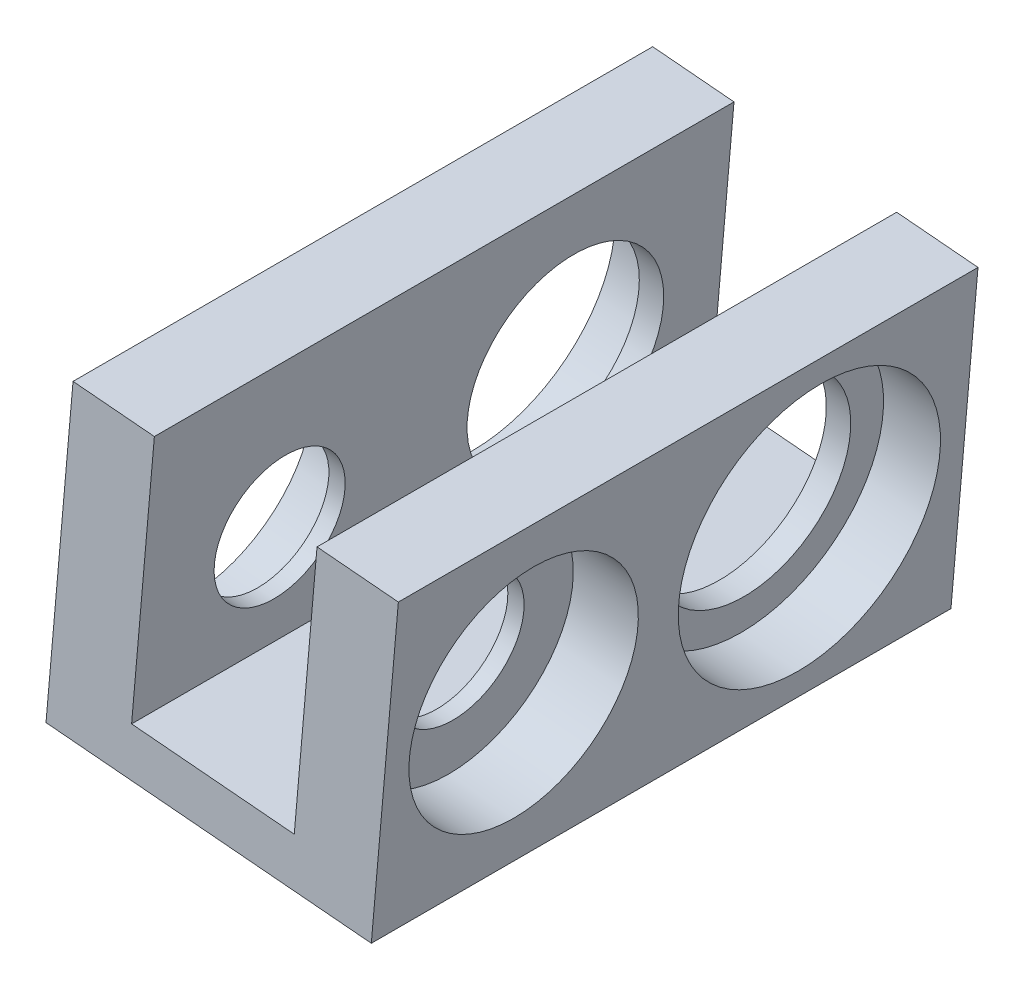
ISO-10303-21;
HEADER;
FILE_DESCRIPTION(('STEP AP214'),'2;1');
FILE_NAME('part.step','',(''),(''),'','','');
FILE_SCHEMA(('AUTOMOTIVE_DESIGN { 1 0 10303 214 1 1 1 1 }'));
ENDSEC;
DATA;
#1=APPLICATION_CONTEXT('core data for automotive mechanical design processes');
#2=APPLICATION_PROTOCOL_DEFINITION('international standard','automotive_design',2000,#1);
#3=PRODUCT_CONTEXT('',#1,'mechanical');
#4=PRODUCT('Part','Part','',(#3));
#5=PRODUCT_RELATED_PRODUCT_CATEGORY('part','',(#4));
#6=PRODUCT_DEFINITION_FORMATION('','',#4);
#7=PRODUCT_DEFINITION_CONTEXT('part definition',#1,'design');
#8=PRODUCT_DEFINITION('design','',#6,#7);
#9=PRODUCT_DEFINITION_SHAPE('','',#8);
#10=(LENGTH_UNIT() NAMED_UNIT(*) SI_UNIT(.MILLI.,.METRE.));
#11=(NAMED_UNIT(*) PLANE_ANGLE_UNIT() SI_UNIT($,.RADIAN.));
#12=(NAMED_UNIT(*) SI_UNIT($,.STERADIAN.) SOLID_ANGLE_UNIT());
#13=UNCERTAINTY_MEASURE_WITH_UNIT(LENGTH_MEASURE(1.E-05),#10,'distance_accuracy_value','');
#14=(GEOMETRIC_REPRESENTATION_CONTEXT(3) GLOBAL_UNCERTAINTY_ASSIGNED_CONTEXT((#13)) GLOBAL_UNIT_ASSIGNED_CONTEXT((#10,
#11,#12)) REPRESENTATION_CONTEXT('',''));
#15=CARTESIAN_POINT('',(0.,0.,0.));
#16=DIRECTION('',(0.,0.,1.));
#17=DIRECTION('',(1.,0.,0.));
#18=AXIS2_PLACEMENT_3D('',#15,#16,#17);
#19=CARTESIAN_POINT('',(41.5037470358753,15.441469553837,17.5000000000001));
#20=DIRECTION('',(-0.996194698091746,0.087155742747655,0.));
#21=DIRECTION('',(-0.087155742747655,-0.996194698091746,0.));
#22=AXIS2_PLACEMENT_3D('',#19,#20,#21);
#23=CYLINDRICAL_SURFACE('',#22,8.);
#24=CARTESIAN_POINT('',(11.6179060931229,18.0561418362666,17.5000000000001));
#25=DIRECTION('',(-0.996194698091746,0.0871557427476548,0.));
#26=DIRECTION('',(-0.0871557427476548,-0.996194698091746,0.));
#27=AXIS2_PLACEMENT_3D('',#24,#25,#26);
#28=CIRCLE('',#27,8.);
#29=CARTESIAN_POINT('',(10.9206601511417,10.0865842515327,17.5000000000001));
#30=VERTEX_POINT('',#29);
#31=EDGE_CURVE('E147',#30,#30,#28,.F.);
#32=ORIENTED_EDGE('',*,*,#31,.T.);
#33=EDGE_LOOP('',(#32));
#34=FACE_BOUND('',#33,.T.);
#35=CARTESIAN_POINT('',(9.62551669693942,18.2304533217619,17.5000000000001));
#36=DIRECTION('',(-0.996194698091746,0.087155742747655,0.));
#37=DIRECTION('',(-0.087155742747655,-0.996194698091746,0.));
#38=AXIS2_PLACEMENT_3D('',#35,#36,#37);
#39=CIRCLE('',#38,8.);
#40=CARTESIAN_POINT('',(8.92827075495818,10.260895737028,17.5000000000001));
#41=VERTEX_POINT('',#40);
#42=EDGE_CURVE('E166',#41,#41,#39,.F.);
#43=ORIENTED_EDGE('',*,*,#42,.F.);
#44=EDGE_LOOP('',(#43));
#45=FACE_BOUND('',#44,.T.);
#46=ADVANCED_FACE('F33',(#34,#45),#23,.F.);
#47=CARTESIAN_POINT('',(41.5037470358753,15.441469553837,-17.4999999999999));
#48=DIRECTION('',(-0.996194698091746,0.087155742747655,0.));
#49=DIRECTION('',(-0.087155742747655,-0.996194698091746,0.));
#50=AXIS2_PLACEMENT_3D('',#47,#48,#49);
#51=CYLINDRICAL_SURFACE('',#50,12.);
#52=CARTESIAN_POINT('',(11.6179060931229,18.0561418362666,-17.4999999999999));
#53=DIRECTION('',(-0.996194698091746,0.0871557427476548,0.));
#54=DIRECTION('',(-0.0871557427476548,-0.996194698091746,0.));
#55=AXIS2_PLACEMENT_3D('',#52,#53,#54);
#56=CIRCLE('',#55,12.);
#57=CARTESIAN_POINT('',(10.572037180151,6.10180545916567,-17.4999999999999));
#58=VERTEX_POINT('',#57);
#59=EDGE_CURVE('E144',#58,#58,#56,.F.);
#60=ORIENTED_EDGE('',*,*,#59,.T.);
#61=EDGE_LOOP('',(#60));
#62=FACE_BOUND('',#61,.T.);
#63=CARTESIAN_POINT('',(8.62932199884767,18.3176090645096,-17.4999999999999));
#64=DIRECTION('',(-0.996194698091746,0.087155742747655,0.));
#65=DIRECTION('',(-0.087155742747655,-0.996194698091746,0.));
#66=AXIS2_PLACEMENT_3D('',#63,#64,#65);
#67=CIRCLE('',#66,12.);
#68=CARTESIAN_POINT('',(7.58345308587581,6.36327268740863,-17.4999999999999));
#69=VERTEX_POINT('',#68);
#70=EDGE_CURVE('E173',#69,#69,#67,.F.);
#71=ORIENTED_EDGE('',*,*,#70,.F.);
#72=EDGE_LOOP('',(#71));
#73=FACE_BOUND('',#72,.T.);
#74=ADVANCED_FACE('F219',(#62,#73),#51,.F.);
#75=CARTESIAN_POINT('',(43.1597061480807,34.3691688175801,-36.4999999999999));
#76=DIRECTION('',(0.087155742747655,0.996194698091746,0.));
#77=DIRECTION('',(-0.996194698091746,0.087155742747655,0.));
#78=AXIS2_PLACEMENT_3D('',#75,#76,#77);
#79=PLANE('',#78);
#80=DIRECTION('',(0.,0.,1.));
#81=VECTOR('',#80,1.);
#82=CARTESIAN_POINT('',(13.2738652053283,36.9838411000098,-36.5));
#83=LINE('',#82,#81);
#84=CARTESIAN_POINT('',(13.2738652053283,36.9838411000098,-36.5));
#85=VERTEX_POINT('',#84);
#86=CARTESIAN_POINT('',(13.2738652053283,36.9838411000098,34.5));
#87=VERTEX_POINT('',#86);
#88=EDGE_CURVE('E132',#85,#87,#83,.T.);
#89=ORIENTED_EDGE('',*,*,#88,.F.);
#90=DIRECTION('',(-0.996194698091746,0.087155742747655,0.));
#91=VECTOR('',#90,1.);
#92=CARTESIAN_POINT('',(43.1597061480807,34.3691688175801,-36.4999999999999));
#93=LINE('',#92,#91);
#94=CARTESIAN_POINT('',(3.31191822441089,37.8553985274863,-36.4999999999999));
#95=VERTEX_POINT('',#94);
#96=EDGE_CURVE('E42',#85,#95,#93,.T.);
#97=ORIENTED_EDGE('',*,*,#96,.T.);
#98=DIRECTION('',(0.,0.,-1.));
#99=VECTOR('',#98,1.);
#100=CARTESIAN_POINT('',(3.31191822441089,37.8553985274863,-36.4999999999999));
#101=LINE('',#100,#99);
#102=CARTESIAN_POINT('',(3.31191822441089,37.8553985274863,34.5000000000002));
#103=VERTEX_POINT('',#102);
#104=EDGE_CURVE('E180',#103,#95,#101,.T.);
#105=ORIENTED_EDGE('',*,*,#104,.F.);
#106=DIRECTION('',(-0.996194698091746,0.087155742747655,0.));
#107=VECTOR('',#106,1.);
#108=CARTESIAN_POINT('',(43.1597061480807,34.3691688175801,34.5000000000002));
#109=LINE('',#108,#107);
#110=EDGE_CURVE('E202',#87,#103,#109,.T.);
#111=ORIENTED_EDGE('',*,*,#110,.F.);
#112=EDGE_LOOP('',(#89,#97,#105,#111));
#113=FACE_BOUND('',#112,.T.);
#114=ADVANCED_FACE('F225',(#113),#79,.T.);
#115=CARTESIAN_POINT('',(31.5418000549578,16.3130269813135,17.5000000000001));
#116=DIRECTION('',(0.996194698091746,-0.0871557427476548,0.));
#117=DIRECTION('',(0.0871557427476548,0.996194698091746,0.));
#118=AXIS2_PLACEMENT_3D('',#115,#116,#117);
#119=CIRCLE('',#118,8.);
#120=CARTESIAN_POINT('',(32.2390459969391,24.2825845660475,17.5000000000001));
#121=VERTEX_POINT('',#120);
#122=EDGE_CURVE('E141',#121,#121,#119,.F.);
#123=ORIENTED_EDGE('',*,*,#122,.T.);
#124=EDGE_LOOP('',(#123));
#125=FACE_BOUND('',#124,.T.);
#126=CARTESIAN_POINT('',(33.5341894511413,16.1387154958182,17.5000000000001));
#127=DIRECTION('',(0.996194698091746,-0.087155742747655,0.));
#128=DIRECTION('',(0.087155742747655,0.996194698091746,0.));
#129=AXIS2_PLACEMENT_3D('',#126,#127,#128);
#130=CIRCLE('',#129,8.);
#131=CARTESIAN_POINT('',(34.2314353931226,24.1082730805522,17.5000000000001));
#132=VERTEX_POINT('',#131);
#133=EDGE_CURVE('E37',#132,#132,#130,.F.);
#134=ORIENTED_EDGE('',*,*,#133,.F.);
#135=EDGE_LOOP('',(#134));
#136=FACE_BOUND('',#135,.T.);
#137=ADVANCED_FACE('F216',(#125,#136),#23,.F.);
#138=CARTESIAN_POINT('',(31.5418000549578,16.3130269813135,-17.4999999999999));
#139=DIRECTION('',(0.996194698091746,-0.0871557427476548,0.));
#140=DIRECTION('',(0.0871557427476548,0.996194698091746,0.));
#141=AXIS2_PLACEMENT_3D('',#138,#139,#140);
#142=CIRCLE('',#141,12.);
#143=CARTESIAN_POINT('',(32.5876689679297,28.2673633584145,-17.4999999999999));
#144=VERTEX_POINT('',#143);
#145=EDGE_CURVE('E134',#144,#144,#142,.F.);
#146=ORIENTED_EDGE('',*,*,#145,.T.);
#147=EDGE_LOOP('',(#146));
#148=FACE_BOUND('',#147,.T.);
#149=CARTESIAN_POINT('',(34.5303841492331,16.0515597530706,-17.4999999999999));
#150=DIRECTION('',(0.996194698091746,-0.087155742747655,0.));
#151=DIRECTION('',(0.087155742747655,0.996194698091746,0.));
#152=AXIS2_PLACEMENT_3D('',#149,#150,#151);
#153=CIRCLE('',#152,12.);
#154=CARTESIAN_POINT('',(35.5762530622049,28.0058961301715,-17.4999999999999));
#155=VERTEX_POINT('',#154);
#156=EDGE_CURVE('E159',#155,#155,#153,.F.);
#157=ORIENTED_EDGE('',*,*,#156,.F.);
#158=EDGE_LOOP('',(#157));
#159=FACE_BOUND('',#158,.T.);
#160=ADVANCED_FACE('F214',(#148,#159),#51,.F.);
#161=CARTESIAN_POINT('',(43.1597061480807,34.3691688175801,-36.4999999999999));
#162=DIRECTION('',(0.,0.,-1.));
#163=DIRECTION('',(0.,1.,0.));
#164=AXIS2_PLACEMENT_3D('',#161,#162,#163);
#165=PLANE('',#164);
#166=DIRECTION('',(-0.0871557427476548,-0.996194698091746,0.));
#167=VECTOR('',#166,1.);
#168=CARTESIAN_POINT('',(10.4848814374034,5.10561076107392,-36.5));
#169=LINE('',#168,#167);
#170=CARTESIAN_POINT('',(10.4848814374034,5.10561076107392,-36.5));
#171=VERTEX_POINT('',#170);
#172=EDGE_CURVE('E112',#85,#171,#169,.T.);
#173=ORIENTED_EDGE('',*,*,#172,.T.);
#174=DIRECTION('',(0.996194698091746,-0.0871557427476548,0.));
#175=VECTOR('',#174,1.);
#176=CARTESIAN_POINT('',(30.4087753992383,3.36249590612082,-36.5));
#177=LINE('',#176,#175);
#178=CARTESIAN_POINT('',(30.4087753992383,3.36249590612082,-36.5));
#179=VERTEX_POINT('',#178);
#180=EDGE_CURVE('E120',#171,#179,#177,.T.);
#181=ORIENTED_EDGE('',*,*,#180,.T.);
#182=DIRECTION('',(0.0871557427476547,0.996194698091746,0.));
#183=VECTOR('',#182,1.);
#184=CARTESIAN_POINT('',(33.1977591671633,35.2407262450567,-36.5));
#185=LINE('',#184,#183);
#186=CARTESIAN_POINT('',(33.1977591671633,35.2407262450567,-36.5));
#187=VERTEX_POINT('',#186);
#188=EDGE_CURVE('E117',#179,#187,#185,.T.);
#189=ORIENTED_EDGE('',*,*,#188,.T.);
#190=CARTESIAN_POINT('',(43.1597061480807,34.3691688175801,-36.4999999999999));
#191=VERTEX_POINT('',#190);
#192=EDGE_CURVE('E11',#191,#187,#93,.T.);
#193=ORIENTED_EDGE('',*,*,#192,.F.);
#194=DIRECTION('',(-0.087155742747655,-0.996194698091746,0.));
#195=VECTOR('',#194,1.);
#196=CARTESIAN_POINT('',(43.1597061480807,34.3691688175801,-36.4999999999999));
#197=LINE('',#196,#195);
#198=CARTESIAN_POINT('',(39.8477879236698,-3.4862297099062,-36.5));
#199=VERTEX_POINT('',#198);
#200=EDGE_CURVE('E177',#191,#199,#197,.T.);
#201=ORIENTED_EDGE('',*,*,#200,.T.);
#202=DIRECTION('',(-0.996194698091746,0.087155742747655,0.));
#203=VECTOR('',#202,1.);
#204=CARTESIAN_POINT('',(39.8477879236698,-3.4862297099062,-36.5));
#205=LINE('',#204,#203);
#206=CARTESIAN_POINT('',(0.,0.,-36.5));
#207=VERTEX_POINT('',#206);
#208=EDGE_CURVE('E86',#199,#207,#205,.T.);
#209=ORIENTED_EDGE('',*,*,#208,.T.);
#210=DIRECTION('',(-0.087155742747655,-0.996194698091746,0.));
#211=VECTOR('',#210,1.);
#212=CARTESIAN_POINT('',(3.31191822441089,37.8553985274863,-36.4999999999999));
#213=LINE('',#212,#211);
#214=EDGE_CURVE('E188',#95,#207,#213,.T.);
#215=ORIENTED_EDGE('',*,*,#214,.F.);
#216=ORIENTED_EDGE('',*,*,#96,.F.);
#217=EDGE_LOOP('',(#173,#181,#189,#193,#201,#209,#215,#216));
#218=FACE_BOUND('',#217,.T.);
#219=ADVANCED_FACE('F35',(#218),#165,.T.);
#220=DIRECTION('',(0.,0.,1.));
#221=VECTOR('',#220,1.);
#222=CARTESIAN_POINT('',(33.1977591671633,35.2407262450567,-36.5));
#223=LINE('',#222,#221);
#224=CARTESIAN_POINT('',(33.1977591671633,35.2407262450567,34.5));
#225=VERTEX_POINT('',#224);
#226=EDGE_CURVE('E135',#187,#225,#223,.T.);
#227=ORIENTED_EDGE('',*,*,#226,.T.);
#228=CARTESIAN_POINT('',(43.1597061480807,34.3691688175801,34.5000000000002));
#229=VERTEX_POINT('',#228);
#230=EDGE_CURVE('E199',#229,#225,#109,.T.);
#231=ORIENTED_EDGE('',*,*,#230,.F.);
#232=DIRECTION('',(0.,0.,-1.));
#233=VECTOR('',#232,1.);
#234=CARTESIAN_POINT('',(43.1597061480807,34.3691688175801,-36.4999999999999));
#235=LINE('',#234,#233);
#236=EDGE_CURVE('E185',#229,#191,#235,.T.);
#237=ORIENTED_EDGE('',*,*,#236,.T.);
#238=ORIENTED_EDGE('',*,*,#192,.T.);
#239=EDGE_LOOP('',(#227,#231,#237,#238));
#240=FACE_BOUND('',#239,.T.);
#241=ADVANCED_FACE('F224',(#240),#79,.T.);
#242=CARTESIAN_POINT('',(43.1597061480807,34.3691688175801,34.5000000000002));
#243=DIRECTION('',(0.,0.,1.));
#244=DIRECTION('',(0.,-1.,0.));
#245=AXIS2_PLACEMENT_3D('',#242,#243,#244);
#246=PLANE('',#245);
#247=DIRECTION('',(-0.0871557427476548,-0.996194698091746,0.));
#248=VECTOR('',#247,1.);
#249=CARTESIAN_POINT('',(10.4848814374034,5.10561076107392,34.5));
#250=LINE('',#249,#248);
#251=CARTESIAN_POINT('',(10.4848814374034,5.10561076107393,34.5));
#252=VERTEX_POINT('',#251);
#253=EDGE_CURVE('E50',#87,#252,#250,.T.);
#254=ORIENTED_EDGE('',*,*,#253,.F.);
#255=ORIENTED_EDGE('',*,*,#110,.T.);
#256=DIRECTION('',(0.087155742747655,0.996194698091746,0.));
#257=VECTOR('',#256,1.);
#258=CARTESIAN_POINT('',(3.31191822441089,37.8553985274863,34.5000000000002));
#259=LINE('',#258,#257);
#260=CARTESIAN_POINT('',(0.,0.,34.5));
#261=VERTEX_POINT('',#260);
#262=EDGE_CURVE('E194',#261,#103,#259,.T.);
#263=ORIENTED_EDGE('',*,*,#262,.F.);
#264=DIRECTION('',(-0.996194698091746,0.087155742747655,0.));
#265=VECTOR('',#264,1.);
#266=CARTESIAN_POINT('',(39.8477879236698,-3.4862297099062,34.5));
#267=LINE('',#266,#265);
#268=CARTESIAN_POINT('',(39.8477879236698,-3.4862297099062,34.5));
#269=VERTEX_POINT('',#268);
#270=EDGE_CURVE('E203',#269,#261,#267,.T.);
#271=ORIENTED_EDGE('',*,*,#270,.F.);
#272=DIRECTION('',(0.087155742747655,0.996194698091746,0.));
#273=VECTOR('',#272,1.);
#274=CARTESIAN_POINT('',(43.1597061480807,34.3691688175801,34.5000000000002));
#275=LINE('',#274,#273);
#276=EDGE_CURVE('E182',#269,#229,#275,.T.);
#277=ORIENTED_EDGE('',*,*,#276,.T.);
#278=ORIENTED_EDGE('',*,*,#230,.T.);
#279=DIRECTION('',(0.0871557427476547,0.996194698091746,0.));
#280=VECTOR('',#279,1.);
#281=CARTESIAN_POINT('',(33.1977591671633,35.2407262450567,34.5));
#282=LINE('',#281,#280);
#283=CARTESIAN_POINT('',(30.4087753992383,3.36249590612082,34.5));
#284=VERTEX_POINT('',#283);
#285=EDGE_CURVE('E124',#284,#225,#282,.T.);
#286=ORIENTED_EDGE('',*,*,#285,.F.);
#287=DIRECTION('',(0.996194698091746,-0.0871557427476548,0.));
#288=VECTOR('',#287,1.);
#289=CARTESIAN_POINT('',(30.4087753992383,3.36249590612082,34.5));
#290=LINE('',#289,#288);
#291=EDGE_CURVE('E126',#252,#284,#290,.T.);
#292=ORIENTED_EDGE('',*,*,#291,.F.);
#293=EDGE_LOOP('',(#254,#255,#263,#271,#277,#278,#286,#292));
#294=FACE_BOUND('',#293,.T.);
#295=ADVANCED_FACE('F290',(#294),#246,.T.);
#296=CARTESIAN_POINT('',(39.8477879236698,-3.4862297099062,-36.5));
#297=DIRECTION('',(-0.087155742747655,-0.996194698091746,0.));
#298=DIRECTION('',(0.996194698091746,-0.087155742747655,0.));
#299=AXIS2_PLACEMENT_3D('',#296,#297,#298);
#300=PLANE('',#299);
#301=DIRECTION('',(0.,0.,1.));
#302=VECTOR('',#301,1.);
#303=CARTESIAN_POINT('',(0.,0.,-36.5));
#304=LINE('',#303,#302);
#305=EDGE_CURVE('E191',#207,#261,#304,.T.);
#306=ORIENTED_EDGE('',*,*,#305,.F.);
#307=ORIENTED_EDGE('',*,*,#208,.F.);
#308=DIRECTION('',(0.,0.,1.));
#309=VECTOR('',#308,1.);
#310=CARTESIAN_POINT('',(39.8477879236698,-3.4862297099062,-36.5));
#311=LINE('',#310,#309);
#312=EDGE_CURVE('E179',#199,#269,#311,.T.);
#313=ORIENTED_EDGE('',*,*,#312,.T.);
#314=ORIENTED_EDGE('',*,*,#270,.T.);
#315=EDGE_LOOP('',(#306,#307,#313,#314));
#316=FACE_BOUND('',#315,.T.);
#317=ADVANCED_FACE('F296',(#316),#300,.T.);
#318=CARTESIAN_POINT('',(39.8477879236698,-3.4862297099062,0.));
#319=DIRECTION('',(-0.996194698091746,0.087155742747655,0.));
#320=DIRECTION('',(-0.087155742747655,-0.996194698091746,0.));
#321=AXIS2_PLACEMENT_3D('',#318,#319,#320);
#322=PLANE('',#321);
#323=CARTESIAN_POINT('',(41.5037470358753,15.441469553837,17.5000000000001));
#324=DIRECTION('',(0.996194698091746,-0.087155742747655,0.));
#325=DIRECTION('',(0.087155742747655,0.996194698091746,0.));
#326=AXIS2_PLACEMENT_3D('',#323,#324,#325);
#327=CIRCLE('',#326,14.);
#328=CARTESIAN_POINT('',(42.7239274343425,29.3881953271214,17.5000000000001));
#329=VERTEX_POINT('',#328);
#330=EDGE_CURVE('E150',#329,#329,#327,.T.);
#331=ORIENTED_EDGE('',*,*,#330,.F.);
#332=EDGE_LOOP('',(#331));
#333=FACE_BOUND('',#332,.T.);
#334=CARTESIAN_POINT('',(41.5037470358753,15.441469553837,-17.4999999999999));
#335=DIRECTION('',(0.996194698091746,-0.087155742747655,0.));
#336=DIRECTION('',(0.087155742747655,0.996194698091746,0.));
#337=AXIS2_PLACEMENT_3D('',#334,#335,#336);
#338=CIRCLE('',#337,16.);
#339=CARTESIAN_POINT('',(42.8982389198378,31.3805847233049,-17.4999999999999));
#340=VERTEX_POINT('',#339);
#341=EDGE_CURVE('E160',#340,#340,#338,.T.);
#342=ORIENTED_EDGE('',*,*,#341,.F.);
#343=EDGE_LOOP('',(#342));
#344=FACE_BOUND('',#343,.T.);
#345=ORIENTED_EDGE('',*,*,#200,.F.);
#346=ORIENTED_EDGE('',*,*,#236,.F.);
#347=ORIENTED_EDGE('',*,*,#276,.F.);
#348=ORIENTED_EDGE('',*,*,#312,.F.);
#349=EDGE_LOOP('',(#345,#346,#347,#348));
#350=FACE_BOUND('',#349,.T.);
#351=ADVANCED_FACE('F295',(#333,#344,#350),#322,.F.);
#352=CARTESIAN_POINT('',(0.,0.,0.));
#353=DIRECTION('',(-0.996194698091746,0.087155742747655,0.));
#354=DIRECTION('',(-0.087155742747655,-0.996194698091746,0.));
#355=AXIS2_PLACEMENT_3D('',#352,#353,#354);
#356=PLANE('',#355);
#357=CARTESIAN_POINT('',(1.65595911220545,18.9276992637432,17.5000000000001));
#358=DIRECTION('',(-0.996194698091746,0.087155742747655,0.));
#359=DIRECTION('',(-0.087155742747655,-0.996194698091746,0.));
#360=AXIS2_PLACEMENT_3D('',#357,#358,#359);
#361=CIRCLE('',#360,14.);
#362=CARTESIAN_POINT('',(0.435778713738275,4.98097349045873,17.5000000000001));
#363=VERTEX_POINT('',#362);
#364=EDGE_CURVE('E167',#363,#363,#361,.T.);
#365=ORIENTED_EDGE('',*,*,#364,.F.);
#366=EDGE_LOOP('',(#365));
#367=FACE_BOUND('',#366,.T.);
#368=CARTESIAN_POINT('',(1.65595911220545,18.9276992637432,-17.4999999999999));
#369=DIRECTION('',(-0.996194698091746,0.087155742747655,0.));
#370=DIRECTION('',(-0.087155742747655,-0.996194698091746,0.));
#371=AXIS2_PLACEMENT_3D('',#368,#369,#370);
#372=CIRCLE('',#371,16.);
#373=CARTESIAN_POINT('',(0.261467228242965,2.98858409427524,-17.4999999999999));
#374=VERTEX_POINT('',#373);
#375=EDGE_CURVE('E174',#374,#374,#372,.T.);
#376=ORIENTED_EDGE('',*,*,#375,.F.);
#377=EDGE_LOOP('',(#376));
#378=FACE_BOUND('',#377,.T.);
#379=ORIENTED_EDGE('',*,*,#214,.T.);
#380=ORIENTED_EDGE('',*,*,#305,.T.);
#381=ORIENTED_EDGE('',*,*,#262,.T.);
#382=ORIENTED_EDGE('',*,*,#104,.T.);
#383=EDGE_LOOP('',(#379,#380,#381,#382));
#384=FACE_BOUND('',#383,.T.);
#385=ADVANCED_FACE('F245',(#367,#378,#384),#356,.T.);
#386=CARTESIAN_POINT('',(8.62932199884767,18.3176090645096,-17.4999999999999));
#387=DIRECTION('',(-0.996194698091746,0.087155742747655,0.));
#388=DIRECTION('',(-0.087155742747655,-0.996194698091746,0.));
#389=AXIS2_PLACEMENT_3D('',#386,#387,#388);
#390=PLANE('',#389);
#391=CARTESIAN_POINT('',(8.62932199884767,18.3176090645096,-17.4999999999999));
#392=DIRECTION('',(-0.996194698091746,0.087155742747655,0.));
#393=DIRECTION('',(-0.087155742747655,-0.996194698091746,0.));
#394=AXIS2_PLACEMENT_3D('',#391,#392,#393);
#395=CIRCLE('',#394,16.);
#396=CARTESIAN_POINT('',(7.23483011488519,2.37849389504165,-17.4999999999999));
#397=VERTEX_POINT('',#396);
#398=EDGE_CURVE('E170',#397,#397,#395,.T.);
#399=ORIENTED_EDGE('',*,*,#398,.T.);
#400=EDGE_LOOP('',(#399));
#401=FACE_BOUND('',#400,.T.);
#402=ORIENTED_EDGE('',*,*,#70,.T.);
#403=EDGE_LOOP('',(#402));
#404=FACE_BOUND('',#403,.T.);
#405=ADVANCED_FACE('F241',(#401,#404),#390,.T.);
#406=CARTESIAN_POINT('',(8.62932199884767,18.3176090645096,-17.4999999999999));
#407=DIRECTION('',(-0.996194698091746,0.087155742747655,0.));
#408=DIRECTION('',(-0.087155742747655,-0.996194698091746,0.));
#409=AXIS2_PLACEMENT_3D('',#406,#407,#408);
#410=CYLINDRICAL_SURFACE('',#409,16.);
#411=ORIENTED_EDGE('',*,*,#398,.F.);
#412=EDGE_LOOP('',(#411));
#413=FACE_BOUND('',#412,.T.);
#414=ORIENTED_EDGE('',*,*,#375,.T.);
#415=EDGE_LOOP('',(#414));
#416=FACE_BOUND('',#415,.T.);
#417=ADVANCED_FACE('F237',(#413,#416),#410,.F.);
#418=CARTESIAN_POINT('',(9.62551669693941,18.2304533217619,17.5000000000001));
#419=DIRECTION('',(-0.996194698091746,0.087155742747655,0.));
#420=DIRECTION('',(-0.087155742747655,-0.996194698091746,0.));
#421=AXIS2_PLACEMENT_3D('',#418,#419,#420);
#422=PLANE('',#421);
#423=CARTESIAN_POINT('',(9.62551669693941,18.2304533217619,17.5000000000001));
#424=DIRECTION('',(-0.996194698091746,0.087155742747655,0.));
#425=DIRECTION('',(-0.087155742747655,-0.996194698091746,0.));
#426=AXIS2_PLACEMENT_3D('',#423,#424,#425);
#427=CIRCLE('',#426,14.);
#428=CARTESIAN_POINT('',(8.40533629847224,4.2837275484775,17.5000000000001));
#429=VERTEX_POINT('',#428);
#430=EDGE_CURVE('E163',#429,#429,#427,.T.);
#431=ORIENTED_EDGE('',*,*,#430,.T.);
#432=EDGE_LOOP('',(#431));
#433=FACE_BOUND('',#432,.T.);
#434=ORIENTED_EDGE('',*,*,#42,.T.);
#435=EDGE_LOOP('',(#434));
#436=FACE_BOUND('',#435,.T.);
#437=ADVANCED_FACE('F240',(#433,#436),#422,.T.);
#438=CARTESIAN_POINT('',(9.62551669693941,18.2304533217619,17.5000000000001));
#439=DIRECTION('',(-0.996194698091746,0.087155742747655,0.));
#440=DIRECTION('',(-0.087155742747655,-0.996194698091746,0.));
#441=AXIS2_PLACEMENT_3D('',#438,#439,#440);
#442=CYLINDRICAL_SURFACE('',#441,14.);
#443=ORIENTED_EDGE('',*,*,#430,.F.);
#444=EDGE_LOOP('',(#443));
#445=FACE_BOUND('',#444,.T.);
#446=ORIENTED_EDGE('',*,*,#364,.T.);
#447=EDGE_LOOP('',(#446));
#448=FACE_BOUND('',#447,.T.);
#449=ADVANCED_FACE('F247',(#445,#448),#442,.F.);
#450=CARTESIAN_POINT('',(34.5303841492331,16.0515597530706,-17.4999999999999));
#451=DIRECTION('',(0.996194698091746,-0.087155742747655,0.));
#452=DIRECTION('',(0.087155742747655,0.996194698091746,0.));
#453=AXIS2_PLACEMENT_3D('',#450,#451,#452);
#454=PLANE('',#453);
#455=CARTESIAN_POINT('',(34.5303841492331,16.0515597530706,-17.4999999999999));
#456=DIRECTION('',(0.996194698091746,-0.087155742747655,0.));
#457=DIRECTION('',(0.087155742747655,0.996194698091746,0.));
#458=AXIS2_PLACEMENT_3D('',#455,#456,#457);
#459=CIRCLE('',#458,16.);
#460=CARTESIAN_POINT('',(35.9248760331956,31.9906749225385,-17.4999999999999));
#461=VERTEX_POINT('',#460);
#462=EDGE_CURVE('E156',#461,#461,#459,.T.);
#463=ORIENTED_EDGE('',*,*,#462,.T.);
#464=EDGE_LOOP('',(#463));
#465=FACE_BOUND('',#464,.T.);
#466=ORIENTED_EDGE('',*,*,#156,.T.);
#467=EDGE_LOOP('',(#466));
#468=FACE_BOUND('',#467,.T.);
#469=ADVANCED_FACE('F212',(#465,#468),#454,.T.);
#470=CARTESIAN_POINT('',(34.5303841492331,16.0515597530706,-17.4999999999999));
#471=DIRECTION('',(0.996194698091746,-0.087155742747655,0.));
#472=DIRECTION('',(0.087155742747655,0.996194698091746,0.));
#473=AXIS2_PLACEMENT_3D('',#470,#471,#472);
#474=CYLINDRICAL_SURFACE('',#473,16.);
#475=ORIENTED_EDGE('',*,*,#462,.F.);
#476=EDGE_LOOP('',(#475));
#477=FACE_BOUND('',#476,.T.);
#478=ORIENTED_EDGE('',*,*,#341,.T.);
#479=EDGE_LOOP('',(#478));
#480=FACE_BOUND('',#479,.T.);
#481=ADVANCED_FACE('F254',(#477,#480),#474,.F.);
#482=CARTESIAN_POINT('',(33.5341894511413,16.1387154958182,17.5000000000001));
#483=DIRECTION('',(0.996194698091746,-0.087155742747655,0.));
#484=DIRECTION('',(0.087155742747655,0.996194698091746,0.));
#485=AXIS2_PLACEMENT_3D('',#482,#483,#484);
#486=PLANE('',#485);
#487=CARTESIAN_POINT('',(33.5341894511413,16.1387154958182,17.5000000000001));
#488=DIRECTION('',(0.996194698091746,-0.087155742747655,0.));
#489=DIRECTION('',(0.087155742747655,0.996194698091746,0.));
#490=AXIS2_PLACEMENT_3D('',#487,#488,#489);
#491=CIRCLE('',#490,14.);
#492=CARTESIAN_POINT('',(34.7543698496085,30.0854412691027,17.5000000000001));
#493=VERTEX_POINT('',#492);
#494=EDGE_CURVE('E151',#493,#493,#491,.T.);
#495=ORIENTED_EDGE('',*,*,#494,.T.);
#496=EDGE_LOOP('',(#495));
#497=FACE_BOUND('',#496,.T.);
#498=ORIENTED_EDGE('',*,*,#133,.T.);
#499=EDGE_LOOP('',(#498));
#500=FACE_BOUND('',#499,.T.);
#501=ADVANCED_FACE('F257',(#497,#500),#486,.T.);
#502=CARTESIAN_POINT('',(33.5341894511413,16.1387154958182,17.5000000000001));
#503=DIRECTION('',(0.996194698091746,-0.087155742747655,0.));
#504=DIRECTION('',(0.087155742747655,0.996194698091746,0.));
#505=AXIS2_PLACEMENT_3D('',#502,#503,#504);
#506=CYLINDRICAL_SURFACE('',#505,14.);
#507=ORIENTED_EDGE('',*,*,#494,.F.);
#508=EDGE_LOOP('',(#507));
#509=FACE_BOUND('',#508,.T.);
#510=ORIENTED_EDGE('',*,*,#330,.T.);
#511=EDGE_LOOP('',(#510));
#512=FACE_BOUND('',#511,.T.);
#513=ADVANCED_FACE('F262',(#509,#512),#506,.F.);
#514=CARTESIAN_POINT('',(10.4848814374034,5.10561076107392,-36.5));
#515=DIRECTION('',(-0.996194698091746,0.0871557427476548,0.));
#516=DIRECTION('',(-0.0871557427476548,-0.996194698091746,0.));
#517=AXIS2_PLACEMENT_3D('',#514,#515,#516);
#518=PLANE('',#517);
#519=ORIENTED_EDGE('',*,*,#59,.F.);
#520=EDGE_LOOP('',(#519));
#521=FACE_BOUND('',#520,.T.);
#522=ORIENTED_EDGE('',*,*,#253,.T.);
#523=DIRECTION('',(0.,0.,1.));
#524=VECTOR('',#523,1.);
#525=CARTESIAN_POINT('',(10.4848814374034,5.10561076107392,-36.5));
#526=LINE('',#525,#524);
#527=EDGE_CURVE('E107',#171,#252,#526,.T.);
#528=ORIENTED_EDGE('',*,*,#527,.F.);
#529=ORIENTED_EDGE('',*,*,#172,.F.);
#530=ORIENTED_EDGE('',*,*,#88,.T.);
#531=EDGE_LOOP('',(#522,#528,#529,#530));
#532=FACE_BOUND('',#531,.T.);
#533=ORIENTED_EDGE('',*,*,#31,.F.);
#534=EDGE_LOOP('',(#533));
#535=FACE_BOUND('',#534,.T.);
#536=ADVANCED_FACE('F109',(#521,#532,#535),#518,.F.);
#537=CARTESIAN_POINT('',(33.1977591671633,35.2407262450567,-36.5));
#538=DIRECTION('',(0.996194698091746,-0.0871557427476548,0.));
#539=DIRECTION('',(0.0871557427476548,0.996194698091746,0.));
#540=AXIS2_PLACEMENT_3D('',#537,#538,#539);
#541=PLANE('',#540);
#542=ORIENTED_EDGE('',*,*,#145,.F.);
#543=EDGE_LOOP('',(#542));
#544=FACE_BOUND('',#543,.T.);
#545=ORIENTED_EDGE('',*,*,#285,.T.);
#546=ORIENTED_EDGE('',*,*,#226,.F.);
#547=ORIENTED_EDGE('',*,*,#188,.F.);
#548=DIRECTION('',(0.,0.,1.));
#549=VECTOR('',#548,1.);
#550=CARTESIAN_POINT('',(30.4087753992383,3.36249590612082,-36.5));
#551=LINE('',#550,#549);
#552=EDGE_CURVE('E116',#179,#284,#551,.T.);
#553=ORIENTED_EDGE('',*,*,#552,.T.);
#554=EDGE_LOOP('',(#545,#546,#547,#553));
#555=FACE_BOUND('',#554,.T.);
#556=ORIENTED_EDGE('',*,*,#122,.F.);
#557=EDGE_LOOP('',(#556));
#558=FACE_BOUND('',#557,.T.);
#559=ADVANCED_FACE('F271',(#544,#555,#558),#541,.F.);
#560=CARTESIAN_POINT('',(30.4087753992383,3.36249590612082,-36.5));
#561=DIRECTION('',(-0.0871557427476548,-0.996194698091746,0.));
#562=DIRECTION('',(0.996194698091746,-0.0871557427476548,0.));
#563=AXIS2_PLACEMENT_3D('',#560,#561,#562);
#564=PLANE('',#563);
#565=ORIENTED_EDGE('',*,*,#291,.T.);
#566=ORIENTED_EDGE('',*,*,#552,.F.);
#567=ORIENTED_EDGE('',*,*,#180,.F.);
#568=ORIENTED_EDGE('',*,*,#527,.T.);
#569=EDGE_LOOP('',(#565,#566,#567,#568));
#570=FACE_BOUND('',#569,.T.);
#571=ADVANCED_FACE('F121',(#570),#564,.F.);
#572=CLOSED_SHELL('',(#46,#74,#114,#137,#160,#219,#241,#295,#317,#351,#385,#405,#417,#437,#449,
#469,#481,#501,#513,#536,#559,#571));
#573=MANIFOLD_SOLID_BREP('B2',#572);
#574=ADVANCED_BREP_SHAPE_REPRESENTATION('',(#18,#573),#14);
#575=SHAPE_DEFINITION_REPRESENTATION(#9,#574);
ENDSEC;
END-ISO-10303-21;
